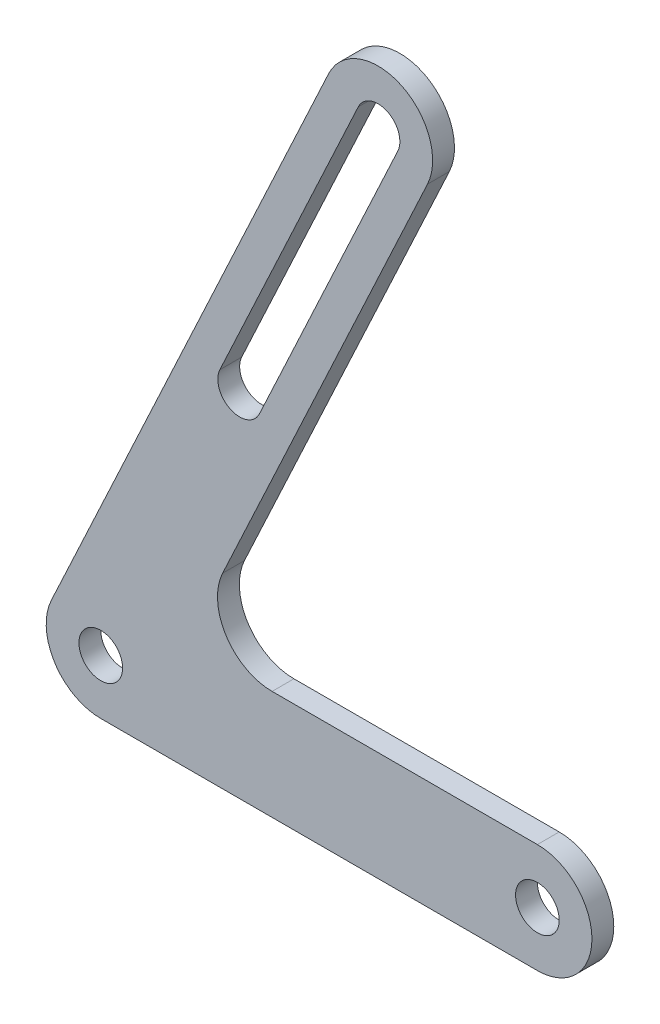
ISO-10303-21;
HEADER;
FILE_DESCRIPTION(('STEP AP214'),'2;1');
FILE_NAME('part.step','',(''),(''),'','','');
FILE_SCHEMA(('AUTOMOTIVE_DESIGN { 1 0 10303 214 1 1 1 1 }'));
ENDSEC;
DATA;
#1=APPLICATION_CONTEXT('core data for automotive mechanical design processes');
#2=APPLICATION_PROTOCOL_DEFINITION('international standard','automotive_design',2000,#1);
#3=PRODUCT_CONTEXT('',#1,'mechanical');
#4=PRODUCT('Part','Part','',(#3));
#5=PRODUCT_RELATED_PRODUCT_CATEGORY('part','',(#4));
#6=PRODUCT_DEFINITION_FORMATION('','',#4);
#7=PRODUCT_DEFINITION_CONTEXT('part definition',#1,'design');
#8=PRODUCT_DEFINITION('design','',#6,#7);
#9=PRODUCT_DEFINITION_SHAPE('','',#8);
#10=(LENGTH_UNIT() NAMED_UNIT(*) SI_UNIT(.MILLI.,.METRE.));
#11=(NAMED_UNIT(*) PLANE_ANGLE_UNIT() SI_UNIT($,.RADIAN.));
#12=(NAMED_UNIT(*) SI_UNIT($,.STERADIAN.) SOLID_ANGLE_UNIT());
#13=UNCERTAINTY_MEASURE_WITH_UNIT(LENGTH_MEASURE(1.E-05),#10,'distance_accuracy_value','');
#14=(GEOMETRIC_REPRESENTATION_CONTEXT(3) GLOBAL_UNCERTAINTY_ASSIGNED_CONTEXT((#13)) GLOBAL_UNIT_ASSIGNED_CONTEXT((#10,
#11,#12)) REPRESENTATION_CONTEXT('',''));
#15=CARTESIAN_POINT('',(0.,0.,0.));
#16=DIRECTION('',(0.,0.,1.));
#17=DIRECTION('',(1.,0.,0.));
#18=AXIS2_PLACEMENT_3D('',#15,#16,#17);
#19=CARTESIAN_POINT('',(0.,10.,2.));
#20=DIRECTION('',(0.,1.,0.));
#21=DIRECTION('',(0.,0.,1.));
#22=AXIS2_PLACEMENT_3D('',#19,#20,#21);
#23=PLANE('',#22);
#24=DIRECTION('',(1.,0.,0.));
#25=VECTOR('',#24,1.);
#26=CARTESIAN_POINT('',(0.,10.,-2.));
#27=LINE('',#26,#25);
#28=CARTESIAN_POINT('',(31.3937115423499,10.,-2.));
#29=VERTEX_POINT('',#28);
#30=CARTESIAN_POINT('',(80.,10.,-2.));
#31=VERTEX_POINT('',#30);
#32=EDGE_CURVE('E179',#29,#31,#27,.T.);
#33=ORIENTED_EDGE('',*,*,#32,.F.);
#34=DIRECTION('',(0.,0.,-1.));
#35=VECTOR('',#34,1.);
#36=CARTESIAN_POINT('',(31.3937115423499,10.,2.));
#37=LINE('',#36,#35);
#38=CARTESIAN_POINT('',(31.3937115423499,10.,2.));
#39=VERTEX_POINT('',#38);
#40=EDGE_CURVE('E57',#29,#39,#37,.F.);
#41=ORIENTED_EDGE('',*,*,#40,.T.);
#42=DIRECTION('',(1.,0.,0.));
#43=VECTOR('',#42,1.);
#44=CARTESIAN_POINT('',(0.,10.,2.));
#45=LINE('',#44,#43);
#46=CARTESIAN_POINT('',(80.,10.,2.));
#47=VERTEX_POINT('',#46);
#48=EDGE_CURVE('E184',#39,#47,#45,.T.);
#49=ORIENTED_EDGE('',*,*,#48,.T.);
#50=DIRECTION('',(0.,0.,-1.));
#51=VECTOR('',#50,1.);
#52=CARTESIAN_POINT('',(80.,10.,2.));
#53=LINE('',#52,#51);
#54=EDGE_CURVE('E208',#47,#31,#53,.T.);
#55=ORIENTED_EDGE('',*,*,#54,.T.);
#56=EDGE_LOOP('',(#33,#41,#49,#55));
#57=FACE_BOUND('',#56,.T.);
#58=ADVANCED_FACE('F41',(#57),#23,.T.);
#59=CARTESIAN_POINT('',(9.06307787036646,-4.22618261740703,2.));
#60=DIRECTION('',(-0.906307787036648,0.422618261740704,0.));
#61=DIRECTION('',(-0.422618261740704,-0.906307787036648,0.));
#62=AXIS2_PLACEMENT_3D('',#59,#60,#61);
#63=PLANE('',#62);
#64=DIRECTION('',(0.422618261740704,0.906307787036648,0.));
#65=VECTOR('',#64,1.);
#66=CARTESIAN_POINT('',(9.06307787036646,-4.22618261740703,2.));
#67=LINE('',#66,#65);
#68=CARTESIAN_POINT('',(22.3306336719835,24.226182617407,2.));
#69=VERTEX_POINT('',#68);
#70=CARTESIAN_POINT('',(59.8690221698597,104.727516535878,2.));
#71=VERTEX_POINT('',#70);
#72=EDGE_CURVE('E187',#69,#71,#67,.T.);
#73=ORIENTED_EDGE('',*,*,#72,.F.);
#74=DIRECTION('',(0.,0.,-1.));
#75=VECTOR('',#74,1.);
#76=CARTESIAN_POINT('',(22.3306336719835,24.226182617407,2.));
#77=LINE('',#76,#75);
#78=CARTESIAN_POINT('',(22.3306336719835,24.226182617407,-2.));
#79=VERTEX_POINT('',#78);
#80=EDGE_CURVE('E252',#69,#79,#77,.T.);
#81=ORIENTED_EDGE('',*,*,#80,.T.);
#82=DIRECTION('',(0.422618261740704,0.906307787036648,0.));
#83=VECTOR('',#82,1.);
#84=CARTESIAN_POINT('',(9.06307787036646,-4.22618261740703,-2.));
#85=LINE('',#84,#83);
#86=CARTESIAN_POINT('',(59.8690221698597,104.727516535878,-2.));
#87=VERTEX_POINT('',#86);
#88=EDGE_CURVE('E211',#79,#87,#85,.T.);
#89=ORIENTED_EDGE('',*,*,#88,.T.);
#90=DIRECTION('',(0.,0.,-1.));
#91=VECTOR('',#90,1.);
#92=CARTESIAN_POINT('',(59.8690221698597,104.727516535878,2.));
#93=LINE('',#92,#91);
#94=EDGE_CURVE('E248',#71,#87,#93,.T.);
#95=ORIENTED_EDGE('',*,*,#94,.F.);
#96=EDGE_LOOP('',(#73,#81,#89,#95));
#97=FACE_BOUND('',#96,.T.);
#98=ADVANCED_FACE('F261',(#97),#63,.F.);
#99=CARTESIAN_POINT('',(50.8059442994933,108.953699153285,2.));
#100=DIRECTION('',(0.,0.,-1.));
#101=DIRECTION('',(-1.,0.,0.));
#102=AXIS2_PLACEMENT_3D('',#99,#100,#101);
#103=CYLINDRICAL_SURFACE('',#102,10.);
#104=CARTESIAN_POINT('',(50.8059442994933,108.953699153285,-2.));
#105=DIRECTION('',(0.,0.,1.));
#106=DIRECTION('',(1.,0.,0.));
#107=AXIS2_PLACEMENT_3D('',#104,#105,#106);
#108=CIRCLE('',#107,10.);
#109=CARTESIAN_POINT('',(41.7428664291267,113.179881770692,-2.));
#110=VERTEX_POINT('',#109);
#111=EDGE_CURVE('E214',#87,#110,#108,.T.);
#112=ORIENTED_EDGE('',*,*,#111,.T.);
#113=DIRECTION('',(0.,0.,-1.));
#114=VECTOR('',#113,1.);
#115=CARTESIAN_POINT('',(41.7428664291267,113.179881770692,2.));
#116=LINE('',#115,#114);
#117=CARTESIAN_POINT('',(41.7428664291267,113.179881770692,2.));
#118=VERTEX_POINT('',#117);
#119=EDGE_CURVE('E245',#118,#110,#116,.T.);
#120=ORIENTED_EDGE('',*,*,#119,.F.);
#121=CARTESIAN_POINT('',(50.8059442994933,108.953699153285,2.));
#122=DIRECTION('',(0.,0.,1.));
#123=DIRECTION('',(1.,0.,0.));
#124=AXIS2_PLACEMENT_3D('',#121,#122,#123);
#125=CIRCLE('',#124,10.);
#126=EDGE_CURVE('E191',#71,#118,#125,.T.);
#127=ORIENTED_EDGE('',*,*,#126,.F.);
#128=ORIENTED_EDGE('',*,*,#94,.T.);
#129=EDGE_LOOP('',(#112,#120,#127,#128));
#130=FACE_BOUND('',#129,.T.);
#131=ADVANCED_FACE('F271',(#130),#103,.T.);
#132=CARTESIAN_POINT('',(-9.06307787036647,4.22618261740703,2.));
#133=DIRECTION('',(-0.906307787036648,0.422618261740703,0.));
#134=DIRECTION('',(-0.422618261740703,-0.906307787036648,0.));
#135=AXIS2_PLACEMENT_3D('',#132,#133,#134);
#136=PLANE('',#135);
#137=DIRECTION('',(0.422618261740703,0.906307787036648,0.));
#138=VECTOR('',#137,1.);
#139=CARTESIAN_POINT('',(-9.06307787036647,4.22618261740703,-2.));
#140=LINE('',#139,#138);
#141=CARTESIAN_POINT('',(-9.06307787036647,4.22618261740703,-2.));
#142=VERTEX_POINT('',#141);
#143=EDGE_CURVE('E218',#142,#110,#140,.T.);
#144=ORIENTED_EDGE('',*,*,#143,.F.);
#145=DIRECTION('',(0.,0.,-1.));
#146=VECTOR('',#145,1.);
#147=CARTESIAN_POINT('',(-9.06307787036647,4.22618261740703,2.));
#148=LINE('',#147,#146);
#149=CARTESIAN_POINT('',(-9.06307787036647,4.22618261740703,2.));
#150=VERTEX_POINT('',#149);
#151=EDGE_CURVE('E242',#150,#142,#148,.T.);
#152=ORIENTED_EDGE('',*,*,#151,.F.);
#153=DIRECTION('',(0.422618261740703,0.906307787036648,0.));
#154=VECTOR('',#153,1.);
#155=CARTESIAN_POINT('',(-9.06307787036647,4.22618261740703,2.));
#156=LINE('',#155,#154);
#157=EDGE_CURVE('E194',#150,#118,#156,.T.);
#158=ORIENTED_EDGE('',*,*,#157,.T.);
#159=ORIENTED_EDGE('',*,*,#119,.T.);
#160=EDGE_LOOP('',(#144,#152,#158,#159));
#161=FACE_BOUND('',#160,.T.);
#162=ADVANCED_FACE('F290',(#161),#136,.T.);
#163=CARTESIAN_POINT('',(0.,0.,2.));
#164=DIRECTION('',(0.,0.,-1.));
#165=DIRECTION('',(-1.,0.,0.));
#166=AXIS2_PLACEMENT_3D('',#163,#164,#165);
#167=CYLINDRICAL_SURFACE('',#166,10.);
#168=CARTESIAN_POINT('',(0.,0.,-2.));
#169=DIRECTION('',(0.,0.,1.));
#170=DIRECTION('',(1.,0.,0.));
#171=AXIS2_PLACEMENT_3D('',#168,#169,#170);
#172=CIRCLE('',#171,10.);
#173=CARTESIAN_POINT('',(0.,-10.,-2.));
#174=VERTEX_POINT('',#173);
#175=EDGE_CURVE('E222',#142,#174,#172,.T.);
#176=ORIENTED_EDGE('',*,*,#175,.T.);
#177=DIRECTION('',(0.,0.,-1.));
#178=VECTOR('',#177,1.);
#179=CARTESIAN_POINT('',(0.,-10.,2.));
#180=LINE('',#179,#178);
#181=CARTESIAN_POINT('',(0.,-10.,2.));
#182=VERTEX_POINT('',#181);
#183=EDGE_CURVE('E238',#182,#174,#180,.T.);
#184=ORIENTED_EDGE('',*,*,#183,.F.);
#185=CARTESIAN_POINT('',(0.,0.,2.));
#186=DIRECTION('',(0.,0.,1.));
#187=DIRECTION('',(1.,0.,0.));
#188=AXIS2_PLACEMENT_3D('',#185,#186,#187);
#189=CIRCLE('',#188,10.);
#190=EDGE_CURVE('E198',#150,#182,#189,.T.);
#191=ORIENTED_EDGE('',*,*,#190,.F.);
#192=ORIENTED_EDGE('',*,*,#151,.T.);
#193=EDGE_LOOP('',(#176,#184,#191,#192));
#194=FACE_BOUND('',#193,.T.);
#195=ADVANCED_FACE('F293',(#194),#167,.T.);
#196=CARTESIAN_POINT('',(0.,-10.,2.));
#197=DIRECTION('',(0.,1.,0.));
#198=DIRECTION('',(0.,0.,1.));
#199=AXIS2_PLACEMENT_3D('',#196,#197,#198);
#200=PLANE('',#199);
#201=DIRECTION('',(1.,0.,0.));
#202=VECTOR('',#201,1.);
#203=CARTESIAN_POINT('',(0.,-10.,-2.));
#204=LINE('',#203,#202);
#205=CARTESIAN_POINT('',(80.,-10.,-2.));
#206=VERTEX_POINT('',#205);
#207=EDGE_CURVE('E225',#174,#206,#204,.T.);
#208=ORIENTED_EDGE('',*,*,#207,.T.);
#209=DIRECTION('',(0.,0.,-1.));
#210=VECTOR('',#209,1.);
#211=CARTESIAN_POINT('',(80.,-10.,2.));
#212=LINE('',#211,#210);
#213=CARTESIAN_POINT('',(80.,-10.,2.));
#214=VERTEX_POINT('',#213);
#215=EDGE_CURVE('E234',#214,#206,#212,.T.);
#216=ORIENTED_EDGE('',*,*,#215,.F.);
#217=DIRECTION('',(1.,0.,0.));
#218=VECTOR('',#217,1.);
#219=CARTESIAN_POINT('',(0.,-10.,2.));
#220=LINE('',#219,#218);
#221=EDGE_CURVE('E201',#182,#214,#220,.T.);
#222=ORIENTED_EDGE('',*,*,#221,.F.);
#223=ORIENTED_EDGE('',*,*,#183,.T.);
#224=EDGE_LOOP('',(#208,#216,#222,#223));
#225=FACE_BOUND('',#224,.T.);
#226=ADVANCED_FACE('F297',(#225),#200,.F.);
#227=CARTESIAN_POINT('',(80.,0.,2.));
#228=DIRECTION('',(0.,0.,-1.));
#229=DIRECTION('',(-1.,0.,0.));
#230=AXIS2_PLACEMENT_3D('',#227,#228,#229);
#231=CYLINDRICAL_SURFACE('',#230,10.);
#232=CARTESIAN_POINT('',(80.,0.,-2.));
#233=DIRECTION('',(0.,0.,1.));
#234=DIRECTION('',(1.,0.,0.));
#235=AXIS2_PLACEMENT_3D('',#232,#233,#234);
#236=CIRCLE('',#235,10.);
#237=EDGE_CURVE('E188',#206,#31,#236,.T.);
#238=ORIENTED_EDGE('',*,*,#237,.T.);
#239=ORIENTED_EDGE('',*,*,#54,.F.);
#240=CARTESIAN_POINT('',(80.,0.,2.));
#241=DIRECTION('',(0.,0.,1.));
#242=DIRECTION('',(1.,0.,0.));
#243=AXIS2_PLACEMENT_3D('',#240,#241,#242);
#244=CIRCLE('',#243,10.);
#245=EDGE_CURVE('E204',#214,#47,#244,.T.);
#246=ORIENTED_EDGE('',*,*,#245,.F.);
#247=ORIENTED_EDGE('',*,*,#215,.T.);
#248=EDGE_LOOP('',(#238,#239,#246,#247));
#249=FACE_BOUND('',#248,.T.);
#250=ADVANCED_FACE('F301',(#249),#231,.T.);
#251=CARTESIAN_POINT('',(0.,0.,2.));
#252=DIRECTION('',(0.,0.,1.));
#253=DIRECTION('',(1.,0.,0.));
#254=AXIS2_PLACEMENT_3D('',#251,#252,#253);
#255=PLANE('',#254);
#256=CARTESIAN_POINT('',(0.,0.,2.));
#257=DIRECTION('',(0.,0.,1.));
#258=DIRECTION('',(1.,0.,0.));
#259=AXIS2_PLACEMENT_3D('',#256,#257,#258);
#260=CIRCLE('',#259,4.);
#261=CARTESIAN_POINT('',(4.,0.,2.));
#262=VERTEX_POINT('',#261);
#263=EDGE_CURVE('E337',#262,#262,#260,.T.);
#264=ORIENTED_EDGE('',*,*,#263,.F.);
#265=EDGE_LOOP('',(#264));
#266=FACE_BOUND('',#265,.T.);
#267=CARTESIAN_POINT('',(80.,0.,2.));
#268=DIRECTION('',(0.,0.,1.));
#269=DIRECTION('',(1.,0.,0.));
#270=AXIS2_PLACEMENT_3D('',#267,#268,#269);
#271=CIRCLE('',#270,4.00000000000001);
#272=CARTESIAN_POINT('',(84.,0.,2.));
#273=VERTEX_POINT('',#272);
#274=EDGE_CURVE('E334',#273,#273,#271,.T.);
#275=ORIENTED_EDGE('',*,*,#274,.F.);
#276=EDGE_LOOP('',(#275));
#277=FACE_BOUND('',#276,.T.);
#278=CARTESIAN_POINT('',(50.8059442994933,108.953699153285,2.));
#279=DIRECTION('',(0.,0.,1.));
#280=DIRECTION('',(1.,0.,0.));
#281=AXIS2_PLACEMENT_3D('',#278,#279,#280);
#282=CIRCLE('',#281,4.);
#283=CARTESIAN_POINT('',(54.4311754476399,107.263226106322,2.));
#284=VERTEX_POINT('',#283);
#285=CARTESIAN_POINT('',(47.1807131513467,110.644172200248,2.));
#286=VERTEX_POINT('',#285);
#287=EDGE_CURVE('E152',#284,#286,#282,.T.);
#288=ORIENTED_EDGE('',*,*,#287,.F.);
#289=DIRECTION('',(-0.422618261740703,-0.906307787036648,0.));
#290=VECTOR('',#289,1.);
#291=CARTESIAN_POINT('',(54.4311754476399,107.263226106322,2.));
#292=LINE('',#291,#290);
#293=CARTESIAN_POINT('',(29.0740797431977,52.8847588841234,2.));
#294=VERTEX_POINT('',#293);
#295=EDGE_CURVE('E157',#284,#294,#292,.T.);
#296=ORIENTED_EDGE('',*,*,#295,.T.);
#297=CARTESIAN_POINT('',(25.4488485950511,54.5752319310862,2.));
#298=DIRECTION('',(0.,0.,1.));
#299=DIRECTION('',(1.,0.,0.));
#300=AXIS2_PLACEMENT_3D('',#297,#298,#299);
#301=CIRCLE('',#300,4.);
#302=CARTESIAN_POINT('',(21.8236174469045,56.265704978049,2.));
#303=VERTEX_POINT('',#302);
#304=EDGE_CURVE('E134',#303,#294,#301,.T.);
#305=ORIENTED_EDGE('',*,*,#304,.F.);
#306=DIRECTION('',(-0.422618261740703,-0.906307787036648,0.));
#307=VECTOR('',#306,1.);
#308=CARTESIAN_POINT('',(47.1807131513467,110.644172200248,2.));
#309=LINE('',#308,#307);
#310=EDGE_CURVE('E147',#286,#303,#309,.T.);
#311=ORIENTED_EDGE('',*,*,#310,.F.);
#312=EDGE_LOOP('',(#288,#296,#305,#311));
#313=FACE_BOUND('',#312,.T.);
#314=ORIENTED_EDGE('',*,*,#48,.F.);
#315=CARTESIAN_POINT('',(31.3937115423499,20.,2.));
#316=DIRECTION('',(0.,0.,1.));
#317=DIRECTION('',(1.,0.,0.));
#318=AXIS2_PLACEMENT_3D('',#315,#316,#317);
#319=CIRCLE('',#318,10.);
#320=EDGE_CURVE('E11',#39,#69,#319,.F.);
#321=ORIENTED_EDGE('',*,*,#320,.T.);
#322=ORIENTED_EDGE('',*,*,#72,.T.);
#323=ORIENTED_EDGE('',*,*,#126,.T.);
#324=ORIENTED_EDGE('',*,*,#157,.F.);
#325=ORIENTED_EDGE('',*,*,#190,.T.);
#326=ORIENTED_EDGE('',*,*,#221,.T.);
#327=ORIENTED_EDGE('',*,*,#245,.T.);
#328=EDGE_LOOP('',(#314,#321,#322,#323,#324,#325,#326,#327));
#329=FACE_BOUND('',#328,.T.);
#330=ADVANCED_FACE('F154',(#266,#277,#313,#329),#255,.T.);
#331=CARTESIAN_POINT('',(0.,0.,-2.));
#332=DIRECTION('',(0.,0.,1.));
#333=DIRECTION('',(1.,0.,0.));
#334=AXIS2_PLACEMENT_3D('',#331,#332,#333);
#335=PLANE('',#334);
#336=CARTESIAN_POINT('',(0.,0.,-2.));
#337=DIRECTION('',(0.,0.,1.));
#338=DIRECTION('',(1.,0.,0.));
#339=AXIS2_PLACEMENT_3D('',#336,#337,#338);
#340=CIRCLE('',#339,4.);
#341=CARTESIAN_POINT('',(4.,0.,-2.));
#342=VERTEX_POINT('',#341);
#343=EDGE_CURVE('E342',#342,#342,#340,.T.);
#344=ORIENTED_EDGE('',*,*,#343,.T.);
#345=EDGE_LOOP('',(#344));
#346=FACE_BOUND('',#345,.T.);
#347=CARTESIAN_POINT('',(80.,0.,-2.));
#348=DIRECTION('',(0.,0.,1.));
#349=DIRECTION('',(1.,0.,0.));
#350=AXIS2_PLACEMENT_3D('',#347,#348,#349);
#351=CIRCLE('',#350,4.00000000000001);
#352=CARTESIAN_POINT('',(84.,0.,-2.));
#353=VERTEX_POINT('',#352);
#354=EDGE_CURVE('E331',#353,#353,#351,.T.);
#355=ORIENTED_EDGE('',*,*,#354,.T.);
#356=EDGE_LOOP('',(#355));
#357=FACE_BOUND('',#356,.T.);
#358=DIRECTION('',(-0.422618261740703,-0.906307787036648,0.));
#359=VECTOR('',#358,1.);
#360=CARTESIAN_POINT('',(54.4311754476399,107.263226106322,-2.));
#361=LINE('',#360,#359);
#362=CARTESIAN_POINT('',(54.4311754476399,107.263226106322,-2.));
#363=VERTEX_POINT('',#362);
#364=CARTESIAN_POINT('',(29.0740797431977,52.8847588841234,-2.));
#365=VERTEX_POINT('',#364);
#366=EDGE_CURVE('E173',#363,#365,#361,.T.);
#367=ORIENTED_EDGE('',*,*,#366,.F.);
#368=CARTESIAN_POINT('',(50.8059442994933,108.953699153285,-2.));
#369=DIRECTION('',(0.,0.,1.));
#370=DIRECTION('',(1.,0.,0.));
#371=AXIS2_PLACEMENT_3D('',#368,#369,#370);
#372=CIRCLE('',#371,4.);
#373=CARTESIAN_POINT('',(47.1807131513467,110.644172200248,-2.));
#374=VERTEX_POINT('',#373);
#375=EDGE_CURVE('E161',#363,#374,#372,.T.);
#376=ORIENTED_EDGE('',*,*,#375,.T.);
#377=DIRECTION('',(-0.422618261740703,-0.906307787036648,0.));
#378=VECTOR('',#377,1.);
#379=CARTESIAN_POINT('',(47.1807131513467,110.644172200248,-2.));
#380=LINE('',#379,#378);
#381=CARTESIAN_POINT('',(21.8236174469045,56.265704978049,-2.));
#382=VERTEX_POINT('',#381);
#383=EDGE_CURVE('E168',#374,#382,#380,.T.);
#384=ORIENTED_EDGE('',*,*,#383,.T.);
#385=CARTESIAN_POINT('',(25.4488485950511,54.5752319310862,-2.));
#386=DIRECTION('',(0.,0.,1.));
#387=DIRECTION('',(1.,0.,0.));
#388=AXIS2_PLACEMENT_3D('',#385,#386,#387);
#389=CIRCLE('',#388,4.);
#390=EDGE_CURVE('E137',#382,#365,#389,.T.);
#391=ORIENTED_EDGE('',*,*,#390,.T.);
#392=EDGE_LOOP('',(#367,#376,#384,#391));
#393=FACE_BOUND('',#392,.T.);
#394=ORIENTED_EDGE('',*,*,#88,.F.);
#395=CARTESIAN_POINT('',(31.3937115423499,20.,-2.));
#396=DIRECTION('',(0.,0.,1.));
#397=DIRECTION('',(1.,0.,0.));
#398=AXIS2_PLACEMENT_3D('',#395,#396,#397);
#399=CIRCLE('',#398,10.);
#400=EDGE_CURVE('E50',#79,#29,#399,.T.);
#401=ORIENTED_EDGE('',*,*,#400,.T.);
#402=ORIENTED_EDGE('',*,*,#32,.T.);
#403=ORIENTED_EDGE('',*,*,#237,.F.);
#404=ORIENTED_EDGE('',*,*,#207,.F.);
#405=ORIENTED_EDGE('',*,*,#175,.F.);
#406=ORIENTED_EDGE('',*,*,#143,.T.);
#407=ORIENTED_EDGE('',*,*,#111,.F.);
#408=EDGE_LOOP('',(#394,#401,#402,#403,#404,#405,#406,#407));
#409=FACE_BOUND('',#408,.T.);
#410=ADVANCED_FACE('F266',(#346,#357,#393,#409),#335,.F.);
#411=CARTESIAN_POINT('',(50.8059442994933,108.953699153285,-2.));
#412=DIRECTION('',(0.,0.,1.));
#413=DIRECTION('',(1.,0.,0.));
#414=AXIS2_PLACEMENT_3D('',#411,#412,#413);
#415=CYLINDRICAL_SURFACE('',#414,4.);
#416=DIRECTION('',(0.,0.,1.));
#417=VECTOR('',#416,1.);
#418=CARTESIAN_POINT('',(47.1807131513467,110.644172200248,-2.));
#419=LINE('',#418,#417);
#420=EDGE_CURVE('E143',#374,#286,#419,.T.);
#421=ORIENTED_EDGE('',*,*,#420,.F.);
#422=ORIENTED_EDGE('',*,*,#375,.F.);
#423=DIRECTION('',(0.,0.,1.));
#424=VECTOR('',#423,1.);
#425=CARTESIAN_POINT('',(54.4311754476399,107.263226106322,-2.));
#426=LINE('',#425,#424);
#427=EDGE_CURVE('E176',#363,#284,#426,.T.);
#428=ORIENTED_EDGE('',*,*,#427,.T.);
#429=ORIENTED_EDGE('',*,*,#287,.T.);
#430=EDGE_LOOP('',(#421,#422,#428,#429));
#431=FACE_BOUND('',#430,.T.);
#432=ADVANCED_FACE('F308',(#431),#415,.F.);
#433=CARTESIAN_POINT('',(54.4311754476399,107.263226106322,-2.));
#434=DIRECTION('',(-0.906307787036648,0.422618261740703,0.));
#435=DIRECTION('',(-0.422618261740703,-0.906307787036648,0.));
#436=AXIS2_PLACEMENT_3D('',#433,#434,#435);
#437=PLANE('',#436);
#438=ORIENTED_EDGE('',*,*,#427,.F.);
#439=ORIENTED_EDGE('',*,*,#366,.T.);
#440=DIRECTION('',(0.,0.,1.));
#441=VECTOR('',#440,1.);
#442=CARTESIAN_POINT('',(29.0740797431977,52.8847588841234,-2.));
#443=LINE('',#442,#441);
#444=EDGE_CURVE('E142',#365,#294,#443,.T.);
#445=ORIENTED_EDGE('',*,*,#444,.T.);
#446=ORIENTED_EDGE('',*,*,#295,.F.);
#447=EDGE_LOOP('',(#438,#439,#445,#446));
#448=FACE_BOUND('',#447,.T.);
#449=ADVANCED_FACE('F315',(#448),#437,.T.);
#450=CARTESIAN_POINT('',(25.4488485950511,54.5752319310862,-2.));
#451=DIRECTION('',(0.,0.,1.));
#452=DIRECTION('',(1.,0.,0.));
#453=AXIS2_PLACEMENT_3D('',#450,#451,#452);
#454=CYLINDRICAL_SURFACE('',#453,4.);
#455=ORIENTED_EDGE('',*,*,#444,.F.);
#456=ORIENTED_EDGE('',*,*,#390,.F.);
#457=DIRECTION('',(0.,0.,1.));
#458=VECTOR('',#457,1.);
#459=CARTESIAN_POINT('',(21.8236174469045,56.265704978049,-2.));
#460=LINE('',#459,#458);
#461=EDGE_CURVE('E129',#382,#303,#460,.T.);
#462=ORIENTED_EDGE('',*,*,#461,.T.);
#463=ORIENTED_EDGE('',*,*,#304,.T.);
#464=EDGE_LOOP('',(#455,#456,#462,#463));
#465=FACE_BOUND('',#464,.T.);
#466=ADVANCED_FACE('F132',(#465),#454,.F.);
#467=CARTESIAN_POINT('',(47.1807131513467,110.644172200248,-2.));
#468=DIRECTION('',(-0.906307787036648,0.422618261740703,0.));
#469=DIRECTION('',(-0.422618261740703,-0.906307787036648,0.));
#470=AXIS2_PLACEMENT_3D('',#467,#468,#469);
#471=PLANE('',#470);
#472=ORIENTED_EDGE('',*,*,#461,.F.);
#473=ORIENTED_EDGE('',*,*,#383,.F.);
#474=ORIENTED_EDGE('',*,*,#420,.T.);
#475=ORIENTED_EDGE('',*,*,#310,.T.);
#476=EDGE_LOOP('',(#472,#473,#474,#475));
#477=FACE_BOUND('',#476,.T.);
#478=ADVANCED_FACE('F148',(#477),#471,.F.);
#479=CARTESIAN_POINT('',(80.,0.,-2.));
#480=DIRECTION('',(0.,0.,1.));
#481=DIRECTION('',(1.,0.,0.));
#482=AXIS2_PLACEMENT_3D('',#479,#480,#481);
#483=CYLINDRICAL_SURFACE('',#482,4.00000000000001);
#484=ORIENTED_EDGE('',*,*,#354,.F.);
#485=EDGE_LOOP('',(#484));
#486=FACE_BOUND('',#485,.T.);
#487=ORIENTED_EDGE('',*,*,#274,.T.);
#488=EDGE_LOOP('',(#487));
#489=FACE_BOUND('',#488,.T.);
#490=ADVANCED_FACE('F279',(#486,#489),#483,.F.);
#491=CARTESIAN_POINT('',(0.,0.,-2.));
#492=DIRECTION('',(0.,0.,1.));
#493=DIRECTION('',(1.,0.,0.));
#494=AXIS2_PLACEMENT_3D('',#491,#492,#493);
#495=CYLINDRICAL_SURFACE('',#494,4.);
#496=ORIENTED_EDGE('',*,*,#343,.F.);
#497=EDGE_LOOP('',(#496));
#498=FACE_BOUND('',#497,.T.);
#499=ORIENTED_EDGE('',*,*,#263,.T.);
#500=EDGE_LOOP('',(#499));
#501=FACE_BOUND('',#500,.T.);
#502=ADVANCED_FACE('F275',(#498,#501),#495,.F.);
#503=CARTESIAN_POINT('',(31.3937115423499,20.,2.));
#504=DIRECTION('',(0.,0.,-1.));
#505=DIRECTION('',(-1.,0.,0.));
#506=AXIS2_PLACEMENT_3D('',#503,#504,#505);
#507=CYLINDRICAL_SURFACE('',#506,10.);
#508=ORIENTED_EDGE('',*,*,#320,.F.);
#509=ORIENTED_EDGE('',*,*,#40,.F.);
#510=ORIENTED_EDGE('',*,*,#400,.F.);
#511=ORIENTED_EDGE('',*,*,#80,.F.);
#512=EDGE_LOOP('',(#508,#509,#510,#511));
#513=FACE_BOUND('',#512,.T.);
#514=ADVANCED_FACE('F43',(#513),#507,.F.);
#515=CLOSED_SHELL('',(#58,#98,#131,#162,#195,#226,#250,#330,#410,#432,#449,#466,#478,#490,#502,#514));
#516=MANIFOLD_SOLID_BREP('B2',#515);
#517=ADVANCED_BREP_SHAPE_REPRESENTATION('',(#18,#516),#14);
#518=SHAPE_DEFINITION_REPRESENTATION(#9,#517);
ENDSEC;
END-ISO-10303-21;
